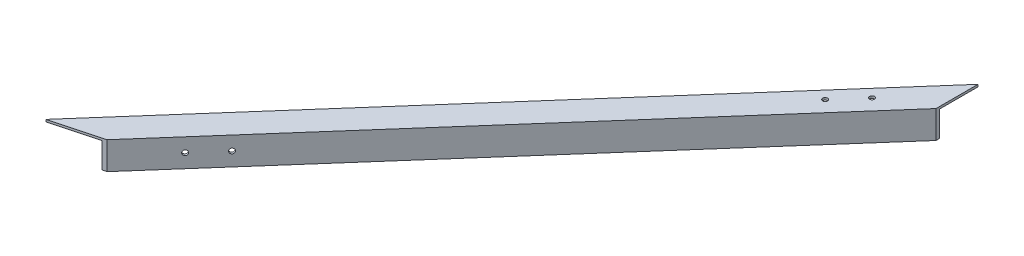
ISO-10303-21;
HEADER;
FILE_DESCRIPTION(('STEP AP214'),'2;1');
FILE_NAME('part.step','',(''),(''),'','','');
FILE_SCHEMA(('AUTOMOTIVE_DESIGN { 1 0 10303 214 1 1 1 1 }'));
ENDSEC;
DATA;
#1=APPLICATION_CONTEXT('core data for automotive mechanical design processes');
#2=APPLICATION_PROTOCOL_DEFINITION('international standard','automotive_design',2000,#1);
#3=PRODUCT_CONTEXT('',#1,'mechanical');
#4=PRODUCT('Part','Part','',(#3));
#5=PRODUCT_RELATED_PRODUCT_CATEGORY('part','',(#4));
#6=PRODUCT_DEFINITION_FORMATION('','',#4);
#7=PRODUCT_DEFINITION_CONTEXT('part definition',#1,'design');
#8=PRODUCT_DEFINITION('design','',#6,#7);
#9=PRODUCT_DEFINITION_SHAPE('','',#8);
#10=(LENGTH_UNIT() NAMED_UNIT(*) SI_UNIT(.MILLI.,.METRE.));
#11=(NAMED_UNIT(*) PLANE_ANGLE_UNIT() SI_UNIT($,.RADIAN.));
#12=(NAMED_UNIT(*) SI_UNIT($,.STERADIAN.) SOLID_ANGLE_UNIT());
#13=UNCERTAINTY_MEASURE_WITH_UNIT(LENGTH_MEASURE(1.E-05),#10,'distance_accuracy_value','');
#14=(GEOMETRIC_REPRESENTATION_CONTEXT(3) GLOBAL_UNCERTAINTY_ASSIGNED_CONTEXT((#13)) GLOBAL_UNIT_ASSIGNED_CONTEXT((#10,
#11,#12)) REPRESENTATION_CONTEXT('',''));
#15=CARTESIAN_POINT('',(0.,0.,0.));
#16=DIRECTION('',(0.,0.,1.));
#17=DIRECTION('',(1.,0.,0.));
#18=AXIS2_PLACEMENT_3D('',#15,#16,#17);
#19=CARTESIAN_POINT('',(-124.5671390046,20.99,1440.996850863));
#20=DIRECTION('',(0.,-1.,0.));
#21=DIRECTION('',(-0.659641271282423,0.,0.751580596623482));
#22=AXIS2_PLACEMENT_3D('',#19,#20,#21);
#23=CYLINDRICAL_SURFACE('',#22,4.5);
#24=CARTESIAN_POINT('',(-124.5671390046,21.,1440.996850863));
#25=DIRECTION('',(0.,-1.,0.));
#26=DIRECTION('',(-0.659641271282423,0.,0.751580596623482));
#27=AXIS2_PLACEMENT_3D('',#24,#25,#26);
#28=CIRCLE('',#27,4.5);
#29=CARTESIAN_POINT('',(-127.5355247254,21.,1444.378963547));
#30=VERTEX_POINT('',#29);
#31=EDGE_CURVE('E182',#30,#30,#28,.T.);
#32=ORIENTED_EDGE('',*,*,#31,.T.);
#33=DIRECTION('',(0.,1.,0.));
#34=VECTOR('',#33,1.);
#35=CARTESIAN_POINT('',(-127.5355247254,20.99,1444.378963547));
#36=LINE('',#35,#34);
#37=CARTESIAN_POINT('',(-127.5355247254,25.,1444.378963547));
#38=VERTEX_POINT('',#37);
#39=EDGE_CURVE('E11',#30,#38,#36,.T.);
#40=ORIENTED_EDGE('',*,*,#39,.T.);
#41=CARTESIAN_POINT('',(-124.5671390046,25.,1440.996850863));
#42=DIRECTION('',(0.,-1.,0.));
#43=DIRECTION('',(-0.659641271282423,0.,0.751580596623482));
#44=AXIS2_PLACEMENT_3D('',#41,#42,#43);
#45=CIRCLE('',#44,4.5);
#46=EDGE_CURVE('E158',#38,#38,#45,.T.);
#47=ORIENTED_EDGE('',*,*,#46,.F.);
#48=ORIENTED_EDGE('',*,*,#39,.F.);
#49=EDGE_LOOP('',(#32,#40,#47,#48));
#50=FACE_BOUND('',#49,.T.);
#51=ADVANCED_FACE('F17',(#50),#23,.F.);
#52=CARTESIAN_POINT('',(-164.1456152816,20.99,1486.09168666));
#53=DIRECTION('',(0.,-1.,0.));
#54=DIRECTION('',(-0.659641271282423,0.,0.751580596623482));
#55=AXIS2_PLACEMENT_3D('',#52,#53,#54);
#56=CYLINDRICAL_SURFACE('',#55,4.5);
#57=CARTESIAN_POINT('',(-164.1456152816,21.,1486.09168666));
#58=DIRECTION('',(0.,-1.,0.));
#59=DIRECTION('',(-0.659641271282423,0.,0.751580596623482));
#60=AXIS2_PLACEMENT_3D('',#57,#58,#59);
#61=CIRCLE('',#60,4.5);
#62=CARTESIAN_POINT('',(-167.1140010024,21.,1489.473799345));
#63=VERTEX_POINT('',#62);
#64=EDGE_CURVE('E229',#63,#63,#61,.T.);
#65=ORIENTED_EDGE('',*,*,#64,.T.);
#66=DIRECTION('',(0.,1.,0.));
#67=VECTOR('',#66,1.);
#68=CARTESIAN_POINT('',(-167.1140010024,20.99,1489.473799345));
#69=LINE('',#68,#67);
#70=CARTESIAN_POINT('',(-167.1140010024,25.,1489.473799345));
#71=VERTEX_POINT('',#70);
#72=EDGE_CURVE('E26',#63,#71,#69,.T.);
#73=ORIENTED_EDGE('',*,*,#72,.T.);
#74=CARTESIAN_POINT('',(-164.1456152816,25.,1486.09168666));
#75=DIRECTION('',(0.,-1.,0.));
#76=DIRECTION('',(-0.659641271282423,0.,0.751580596623482));
#77=AXIS2_PLACEMENT_3D('',#74,#75,#76);
#78=CIRCLE('',#77,4.5);
#79=EDGE_CURVE('E175',#71,#71,#78,.T.);
#80=ORIENTED_EDGE('',*,*,#79,.F.);
#81=ORIENTED_EDGE('',*,*,#72,.F.);
#82=EDGE_LOOP('',(#65,#73,#80,#81));
#83=FACE_BOUND('',#82,.T.);
#84=ADVANCED_FACE('F264',(#83),#56,.F.);
#85=CARTESIAN_POINT('',(66.957941470789,-25.,1260.676820218));
#86=DIRECTION('',(-0.751580596623482,0.,-0.659641271282423));
#87=DIRECTION('',(-0.659641271282423,0.,0.751580596623482));
#88=AXIS2_PLACEMENT_3D('',#85,#86,#87);
#89=PLANE('',#88);
#90=CARTESIAN_POINT('',(-647.4637189812,0.,2074.672974157));
#91=DIRECTION('',(-0.751580596623482,0.,-0.659641271282423));
#92=DIRECTION('',(-0.659641271282423,0.,0.751580596623482));
#93=AXIS2_PLACEMENT_3D('',#90,#91,#92);
#94=CIRCLE('',#93,4.5);
#95=CARTESIAN_POINT('',(-650.432104702,0.,2078.055086842));
#96=VERTEX_POINT('',#95);
#97=EDGE_CURVE('E206',#96,#96,#94,.T.);
#98=ORIENTED_EDGE('',*,*,#97,.F.);
#99=EDGE_LOOP('',(#98));
#100=FACE_BOUND('',#99,.T.);
#101=CARTESIAN_POINT('',(-687.0421952582,0.,2119.767809954));
#102=DIRECTION('',(-0.751580596623482,0.,-0.659641271282423));
#103=DIRECTION('',(-0.659641271282423,0.,0.751580596623482));
#104=AXIS2_PLACEMENT_3D('',#101,#102,#103);
#105=CIRCLE('',#104,4.5);
#106=CARTESIAN_POINT('',(-690.0105809789,0.,2123.149922639));
#107=VERTEX_POINT('',#106);
#108=EDGE_CURVE('E207',#107,#107,#105,.T.);
#109=ORIENTED_EDGE('',*,*,#108,.F.);
#110=EDGE_LOOP('',(#109));
#111=FACE_BOUND('',#110,.T.);
#112=DIRECTION('',(0.,1.,0.));
#113=VECTOR('',#112,1.);
#114=CARTESIAN_POINT('',(-50.,-12.5,1393.936098037));
#115=LINE('',#114,#113);
#116=CARTESIAN_POINT('',(-50.,-25.,1393.936098037));
#117=VERTEX_POINT('',#116);
#118=CARTESIAN_POINT('',(-50.,21.,1393.936098037));
#119=VERTEX_POINT('',#118);
#120=EDGE_CURVE('E171',#117,#119,#115,.T.);
#121=ORIENTED_EDGE('',*,*,#120,.F.);
#122=DIRECTION('',(-0.659641271282423,0.,0.751580596623482));
#123=VECTOR('',#122,1.);
#124=CARTESIAN_POINT('',(66.957941470789,-25.,1260.676820218));
#125=LINE('',#124,#123);
#126=CARTESIAN_POINT('',(-756.9585760234,-25.,2199.428979528));
#127=VERTEX_POINT('',#126);
#128=EDGE_CURVE('E157',#117,#127,#125,.T.);
#129=ORIENTED_EDGE('',*,*,#128,.T.);
#130=DIRECTION('',(0.,-1.,0.));
#131=VECTOR('',#130,1.);
#132=CARTESIAN_POINT('',(-756.9585760234,-12.5,2199.428979528));
#133=LINE('',#132,#131);
#134=CARTESIAN_POINT('',(-756.9585760234,21.,2199.428979528));
#135=VERTEX_POINT('',#134);
#136=EDGE_CURVE('E211',#135,#127,#133,.T.);
#137=ORIENTED_EDGE('',*,*,#136,.F.);
#138=DIRECTION('',(-0.659641271282423,0.,0.751580596623482));
#139=VECTOR('',#138,1.);
#140=CARTESIAN_POINT('',(66.957941470789,21.,1260.676820218));
#141=LINE('',#140,#139);
#142=EDGE_CURVE('E226',#119,#135,#141,.T.);
#143=ORIENTED_EDGE('',*,*,#142,.F.);
#144=EDGE_LOOP('',(#121,#129,#137,#143));
#145=FACE_BOUND('',#144,.T.);
#146=ADVANCED_FACE('F19',(#100,#111,#145),#89,.T.);
#147=CARTESIAN_POINT('',(66.957941470789,21.,1260.676820218));
#148=DIRECTION('',(0.,-1.,0.));
#149=DIRECTION('',(0.,0.,-1.));
#150=AXIS2_PLACEMENT_3D('',#147,#148,#149);
#151=PLANE('',#150);
#152=ORIENTED_EDGE('',*,*,#31,.F.);
#153=EDGE_LOOP('',(#152));
#154=FACE_BOUND('',#153,.T.);
#155=ORIENTED_EDGE('',*,*,#64,.F.);
#156=EDGE_LOOP('',(#155));
#157=FACE_BOUND('',#156,.T.);
#158=DIRECTION('',(0.,0.,-1.));
#159=VECTOR('',#158,1.);
#160=CARTESIAN_POINT('',(-50.,21.,1330.338410109));
#161=LINE('',#160,#159);
#162=CARTESIAN_POINT('',(-50.,21.,1324.201225459));
#163=VERTEX_POINT('',#162);
#164=EDGE_CURVE('E164',#119,#163,#161,.T.);
#165=ORIENTED_EDGE('',*,*,#164,.F.);
#166=ORIENTED_EDGE('',*,*,#142,.T.);
#167=DIRECTION('',(0.965925826288944,0.,-0.258819045102985));
#168=VECTOR('',#167,1.);
#169=CARTESIAN_POINT('',(119.3447342859,21.,1964.624215206));
#170=LINE('',#169,#168);
#171=CARTESIAN_POINT('',(-836.9822002931,21.,2220.871245026));
#172=VERTEX_POINT('',#171);
#173=EDGE_CURVE('E202',#172,#135,#170,.T.);
#174=ORIENTED_EDGE('',*,*,#173,.F.);
#175=DIRECTION('',(-0.659641271282423,0.,0.751580596623482));
#176=VECTOR('',#175,1.);
#177=CARTESIAN_POINT('',(32.385234026112,21.,1230.333321739));
#178=LINE('',#177,#176);
#179=EDGE_CURVE('E223',#163,#172,#178,.T.);
#180=ORIENTED_EDGE('',*,*,#179,.F.);
#181=EDGE_LOOP('',(#165,#166,#174,#180));
#182=FACE_BOUND('',#181,.T.);
#183=ADVANCED_FACE('F235',(#154,#157,#182),#151,.T.);
#184=CARTESIAN_POINT('',(32.385234026112,21.,1230.333321739));
#185=DIRECTION('',(-0.751580596623482,0.,-0.659641271282423));
#186=DIRECTION('',(-0.659641271282423,0.,0.751580596623482));
#187=AXIS2_PLACEMENT_3D('',#184,#185,#186);
#188=PLANE('',#187);
#189=DIRECTION('',(0.,1.,0.));
#190=VECTOR('',#189,1.);
#191=CARTESIAN_POINT('',(-50.,10.5,1324.201225459));
#192=LINE('',#191,#190);
#193=CARTESIAN_POINT('',(-50.,25.,1324.201225459));
#194=VERTEX_POINT('',#193);
#195=EDGE_CURVE('E127',#163,#194,#192,.T.);
#196=ORIENTED_EDGE('',*,*,#195,.F.);
#197=ORIENTED_EDGE('',*,*,#179,.T.);
#198=DIRECTION('',(0.,-1.,0.));
#199=VECTOR('',#198,1.);
#200=CARTESIAN_POINT('',(-836.9822002931,10.5,2220.871245026));
#201=LINE('',#200,#199);
#202=CARTESIAN_POINT('',(-836.9822002931,25.,2220.871245026));
#203=VERTEX_POINT('',#202);
#204=EDGE_CURVE('E198',#203,#172,#201,.T.);
#205=ORIENTED_EDGE('',*,*,#204,.F.);
#206=DIRECTION('',(-0.659641271282423,0.,0.751580596623482));
#207=VECTOR('',#206,1.);
#208=CARTESIAN_POINT('',(32.385234026112,25.,1230.333321739));
#209=LINE('',#208,#207);
#210=EDGE_CURVE('E131',#194,#203,#209,.T.);
#211=ORIENTED_EDGE('',*,*,#210,.F.);
#212=EDGE_LOOP('',(#196,#197,#205,#211));
#213=FACE_BOUND('',#212,.T.);
#214=ADVANCED_FACE('F238',(#213),#188,.T.);
#215=CARTESIAN_POINT('',(-647.4712347872,0.,2074.666377744));
#216=DIRECTION('',(-0.751580596623482,0.,-0.659641271282423));
#217=DIRECTION('',(-0.659641271282423,0.,0.751580596623482));
#218=AXIS2_PLACEMENT_3D('',#215,#216,#217);
#219=CYLINDRICAL_SURFACE('',#218,4.5);
#220=ORIENTED_EDGE('',*,*,#97,.T.);
#221=DIRECTION('',(0.751580596623482,0.,0.659641271282423));
#222=VECTOR('',#221,1.);
#223=CARTESIAN_POINT('',(-650.439620508,0.,2078.048490429));
#224=LINE('',#223,#222);
#225=CARTESIAN_POINT('',(-647.4257823155,0.,2080.693651927));
#226=VERTEX_POINT('',#225);
#227=EDGE_CURVE('E220',#96,#226,#224,.T.);
#228=ORIENTED_EDGE('',*,*,#227,.T.);
#229=CARTESIAN_POINT('',(-644.4573965948,0.,2077.311539242));
#230=DIRECTION('',(-0.751580596623482,0.,-0.659641271282423));
#231=DIRECTION('',(-0.659641271282423,0.,0.751580596623482));
#232=AXIS2_PLACEMENT_3D('',#229,#230,#231);
#233=CIRCLE('',#232,4.5);
#234=EDGE_CURVE('E168',#226,#226,#233,.T.);
#235=ORIENTED_EDGE('',*,*,#234,.F.);
#236=ORIENTED_EDGE('',*,*,#227,.F.);
#237=EDGE_LOOP('',(#220,#228,#235,#236));
#238=FACE_BOUND('',#237,.T.);
#239=ADVANCED_FACE('F251',(#238),#219,.F.);
#240=CARTESIAN_POINT('',(-687.0497110642,0.,2119.761213542));
#241=DIRECTION('',(-0.751580596623482,0.,-0.659641271282423));
#242=DIRECTION('',(-0.659641271282423,0.,0.751580596623482));
#243=AXIS2_PLACEMENT_3D('',#240,#241,#242);
#244=CYLINDRICAL_SURFACE('',#243,4.5);
#245=ORIENTED_EDGE('',*,*,#108,.T.);
#246=DIRECTION('',(0.751580596623482,0.,0.659641271282423));
#247=VECTOR('',#246,1.);
#248=CARTESIAN_POINT('',(-690.0180967849,0.,2123.143326226));
#249=LINE('',#248,#247);
#250=CARTESIAN_POINT('',(-687.0042585925,0.,2125.788487724));
#251=VERTEX_POINT('',#250);
#252=EDGE_CURVE('E203',#107,#251,#249,.T.);
#253=ORIENTED_EDGE('',*,*,#252,.T.);
#254=CARTESIAN_POINT('',(-684.0358728717,0.,2122.406375039));
#255=DIRECTION('',(-0.751580596623482,0.,-0.659641271282423));
#256=DIRECTION('',(-0.659641271282423,0.,0.751580596623482));
#257=AXIS2_PLACEMENT_3D('',#254,#255,#256);
#258=CIRCLE('',#257,4.5);
#259=EDGE_CURVE('E161',#251,#251,#258,.T.);
#260=ORIENTED_EDGE('',*,*,#259,.F.);
#261=ORIENTED_EDGE('',*,*,#252,.F.);
#262=EDGE_LOOP('',(#245,#253,#260,#261));
#263=FACE_BOUND('',#262,.T.);
#264=ADVANCED_FACE('F258',(#263),#244,.F.);
#265=CARTESIAN_POINT('',(-7.764571353077,0.,1998.683051002));
#266=DIRECTION('',(-0.258819045102985,0.,-0.965925826288944));
#267=DIRECTION('',(-0.965925826288944,0.,0.258819045102985));
#268=AXIS2_PLACEMENT_3D('',#265,#266,#267);
#269=PLANE('',#268);
#270=DIRECTION('',(-0.965925826288944,0.,0.258819045102985));
#271=VECTOR('',#270,1.);
#272=CARTESIAN_POINT('',(107.00928400343,25.,1967.929489147));
#273=LINE('',#272,#271);
#274=CARTESIAN_POINT('',(-750.,25.,2197.564434702));
#275=VERTEX_POINT('',#274);
#276=EDGE_CURVE('E137',#275,#203,#273,.T.);
#277=ORIENTED_EDGE('',*,*,#276,.T.);
#278=ORIENTED_EDGE('',*,*,#204,.T.);
#279=ORIENTED_EDGE('',*,*,#173,.T.);
#280=ORIENTED_EDGE('',*,*,#136,.T.);
#281=DIRECTION('',(0.965925826288944,0.,-0.258819045102985));
#282=VECTOR('',#281,1.);
#283=CARTESIAN_POINT('',(120.41738213655,-25.,1964.33680008));
#284=LINE('',#283,#282);
#285=CARTESIAN_POINT('',(-750.,-25.,2197.564434702));
#286=VERTEX_POINT('',#285);
#287=EDGE_CURVE('E154',#127,#286,#284,.T.);
#288=ORIENTED_EDGE('',*,*,#287,.T.);
#289=DIRECTION('',(0.,1.,0.));
#290=VECTOR('',#289,1.);
#291=CARTESIAN_POINT('',(-750.,12.5,2197.564434702));
#292=LINE('',#291,#290);
#293=EDGE_CURVE('E142',#286,#275,#292,.T.);
#294=ORIENTED_EDGE('',*,*,#293,.T.);
#295=EDGE_LOOP('',(#277,#278,#279,#280,#288,#294));
#296=FACE_BOUND('',#295,.T.);
#297=ADVANCED_FACE('F248',(#296),#269,.F.);
#298=CARTESIAN_POINT('',(69.964263857283,-25.,1263.315385303));
#299=DIRECTION('',(0.,-1.,0.));
#300=DIRECTION('',(0.,0.,-1.));
#301=AXIS2_PLACEMENT_3D('',#298,#299,#300);
#302=PLANE('',#301);
#303=DIRECTION('',(0.,0.,-1.));
#304=VECTOR('',#303,1.);
#305=CARTESIAN_POINT('',(-50.,-25.,1331.657692652));
#306=LINE('',#305,#304);
#307=CARTESIAN_POINT('',(-50.,-25.,1400.));
#308=VERTEX_POINT('',#307);
#309=EDGE_CURVE('E179',#308,#117,#306,.T.);
#310=ORIENTED_EDGE('',*,*,#309,.F.);
#311=DIRECTION('',(-0.659641271282423,0.,0.751580596623482));
#312=VECTOR('',#311,1.);
#313=CARTESIAN_POINT('',(69.964263857283,-25.,1263.315385303));
#314=LINE('',#313,#312);
#315=EDGE_CURVE('E147',#308,#286,#314,.T.);
#316=ORIENTED_EDGE('',*,*,#315,.T.);
#317=ORIENTED_EDGE('',*,*,#287,.F.);
#318=ORIENTED_EDGE('',*,*,#128,.F.);
#319=EDGE_LOOP('',(#310,#316,#317,#318));
#320=FACE_BOUND('',#319,.T.);
#321=ADVANCED_FACE('F276',(#320),#302,.T.);
#322=CARTESIAN_POINT('',(32.385234026112,25.,1230.333321739));
#323=DIRECTION('',(0.,1.,0.));
#324=DIRECTION('',(1.,0.,0.));
#325=AXIS2_PLACEMENT_3D('',#322,#323,#324);
#326=PLANE('',#325);
#327=ORIENTED_EDGE('',*,*,#46,.T.);
#328=EDGE_LOOP('',(#327));
#329=FACE_BOUND('',#328,.T.);
#330=ORIENTED_EDGE('',*,*,#79,.T.);
#331=EDGE_LOOP('',(#330));
#332=FACE_BOUND('',#331,.T.);
#333=DIRECTION('',(0.,0.,1.));
#334=VECTOR('',#333,1.);
#335=CARTESIAN_POINT('',(-50.,25.,1315.16666087));
#336=LINE('',#335,#334);
#337=CARTESIAN_POINT('',(-50.,25.,1400.));
#338=VERTEX_POINT('',#337);
#339=EDGE_CURVE('E119',#194,#338,#336,.T.);
#340=ORIENTED_EDGE('',*,*,#339,.F.);
#341=ORIENTED_EDGE('',*,*,#210,.T.);
#342=ORIENTED_EDGE('',*,*,#276,.F.);
#343=DIRECTION('',(-0.659641271282423,0.,0.751580596623482));
#344=VECTOR('',#343,1.);
#345=CARTESIAN_POINT('',(69.964263857283,25.,1263.315385303));
#346=LINE('',#345,#344);
#347=EDGE_CURVE('E134',#338,#275,#346,.T.);
#348=ORIENTED_EDGE('',*,*,#347,.F.);
#349=EDGE_LOOP('',(#340,#341,#342,#348));
#350=FACE_BOUND('',#349,.T.);
#351=ADVANCED_FACE('F135',(#329,#332,#350),#326,.T.);
#352=CARTESIAN_POINT('',(-50.,0.,1400.));
#353=DIRECTION('',(-1.,0.,0.));
#354=DIRECTION('',(0.,0.,1.));
#355=AXIS2_PLACEMENT_3D('',#352,#353,#354);
#356=PLANE('',#355);
#357=ORIENTED_EDGE('',*,*,#309,.T.);
#358=ORIENTED_EDGE('',*,*,#120,.T.);
#359=ORIENTED_EDGE('',*,*,#164,.T.);
#360=ORIENTED_EDGE('',*,*,#195,.T.);
#361=ORIENTED_EDGE('',*,*,#339,.T.);
#362=DIRECTION('',(0.,-1.,0.));
#363=VECTOR('',#362,1.);
#364=CARTESIAN_POINT('',(-50.,12.5,1400.));
#365=LINE('',#364,#363);
#366=EDGE_CURVE('E124',#338,#308,#365,.T.);
#367=ORIENTED_EDGE('',*,*,#366,.T.);
#368=EDGE_LOOP('',(#357,#358,#359,#360,#361,#367));
#369=FACE_BOUND('',#368,.T.);
#370=ADVANCED_FACE('F122',(#369),#356,.F.);
#371=CARTESIAN_POINT('',(69.964263857283,25.,1263.315385303));
#372=DIRECTION('',(0.751580596623482,0.,0.659641271282423));
#373=DIRECTION('',(0.,-1.,0.));
#374=AXIS2_PLACEMENT_3D('',#371,#372,#373);
#375=PLANE('',#374);
#376=ORIENTED_EDGE('',*,*,#234,.T.);
#377=EDGE_LOOP('',(#376));
#378=FACE_BOUND('',#377,.T.);
#379=ORIENTED_EDGE('',*,*,#259,.T.);
#380=EDGE_LOOP('',(#379));
#381=FACE_BOUND('',#380,.T.);
#382=ORIENTED_EDGE('',*,*,#366,.F.);
#383=ORIENTED_EDGE('',*,*,#347,.T.);
#384=ORIENTED_EDGE('',*,*,#293,.F.);
#385=ORIENTED_EDGE('',*,*,#315,.F.);
#386=EDGE_LOOP('',(#382,#383,#384,#385));
#387=FACE_BOUND('',#386,.T.);
#388=ADVANCED_FACE('F145',(#378,#381,#387),#375,.T.);
#389=CLOSED_SHELL('',(#51,#84,#146,#183,#214,#239,#264,#297,#321,#351,#370,#388));
#390=MANIFOLD_SOLID_BREP('B1',#389);
#391=ADVANCED_BREP_SHAPE_REPRESENTATION('',(#18,#390),#14);
#392=SHAPE_DEFINITION_REPRESENTATION(#9,#391);
ENDSEC;
END-ISO-10303-21;
